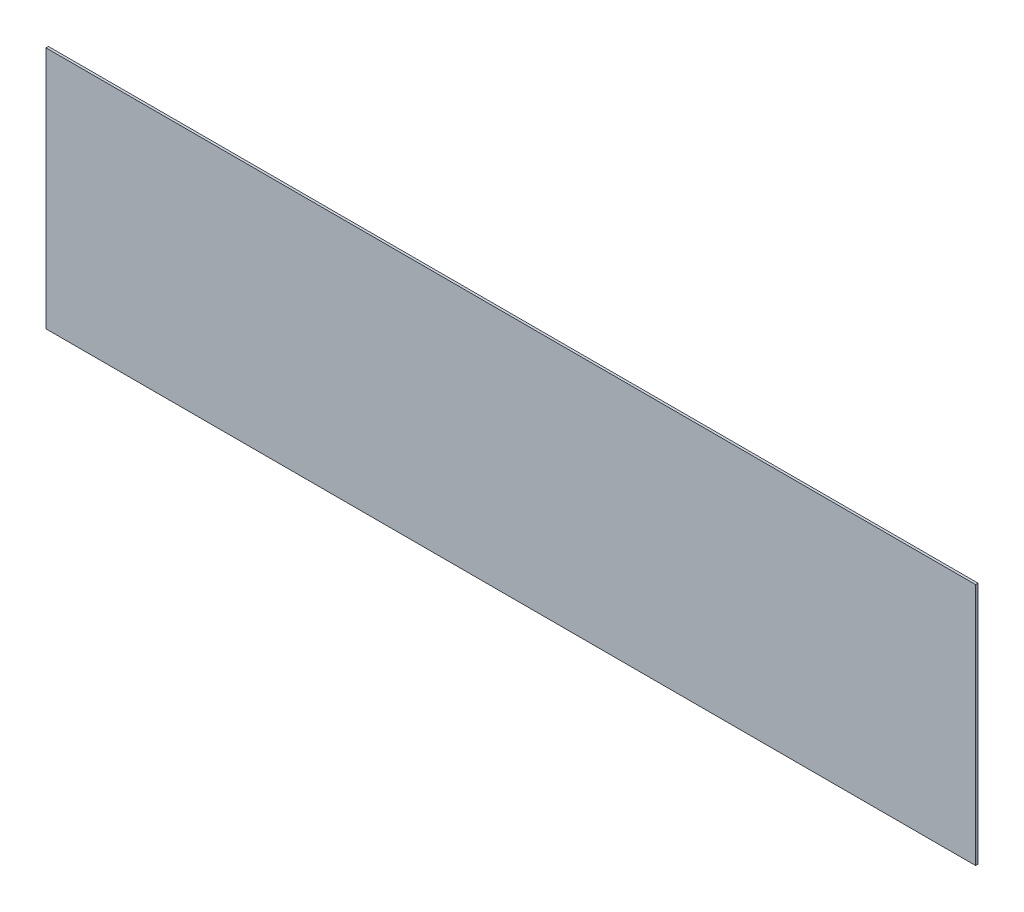
ISO-10303-21;
HEADER;
FILE_DESCRIPTION(('STEP AP214'),'2;1');
FILE_NAME('part.step','',(''),(''),'','','');
FILE_SCHEMA(('AUTOMOTIVE_DESIGN { 1 0 10303 214 1 1 1 1 }'));
ENDSEC;
DATA;
#1=APPLICATION_CONTEXT('core data for automotive mechanical design processes');
#2=APPLICATION_PROTOCOL_DEFINITION('international standard','automotive_design',2000,#1);
#3=PRODUCT_CONTEXT('',#1,'mechanical');
#4=PRODUCT('Part','Part','',(#3));
#5=PRODUCT_RELATED_PRODUCT_CATEGORY('part','',(#4));
#6=PRODUCT_DEFINITION_FORMATION('','',#4);
#7=PRODUCT_DEFINITION_CONTEXT('part definition',#1,'design');
#8=PRODUCT_DEFINITION('design','',#6,#7);
#9=PRODUCT_DEFINITION_SHAPE('','',#8);
#10=(LENGTH_UNIT() NAMED_UNIT(*) SI_UNIT(.MILLI.,.METRE.));
#11=(NAMED_UNIT(*) PLANE_ANGLE_UNIT() SI_UNIT($,.RADIAN.));
#12=(NAMED_UNIT(*) SI_UNIT($,.STERADIAN.) SOLID_ANGLE_UNIT());
#13=UNCERTAINTY_MEASURE_WITH_UNIT(LENGTH_MEASURE(1.E-05),#10,'distance_accuracy_value','');
#14=(GEOMETRIC_REPRESENTATION_CONTEXT(3) GLOBAL_UNCERTAINTY_ASSIGNED_CONTEXT((#13)) GLOBAL_UNIT_ASSIGNED_CONTEXT((#10,
#11,#12)) REPRESENTATION_CONTEXT('',''));
#15=CARTESIAN_POINT('',(0.,0.,0.));
#16=DIRECTION('',(0.,0.,1.));
#17=DIRECTION('',(1.,0.,0.));
#18=AXIS2_PLACEMENT_3D('',#15,#16,#17);
#19=CARTESIAN_POINT('',(189.06,49.5,1.));
#20=DIRECTION('',(-1.,0.,0.));
#21=DIRECTION('',(0.,0.,1.));
#22=AXIS2_PLACEMENT_3D('',#19,#20,#21);
#23=PLANE('',#22);
#24=DIRECTION('',(0.,1.,0.));
#25=VECTOR('',#24,1.);
#26=CARTESIAN_POINT('',(189.06,49.5,0.));
#27=LINE('',#26,#25);
#28=CARTESIAN_POINT('',(189.06,-49.5,0.));
#29=VERTEX_POINT('',#28);
#30=CARTESIAN_POINT('',(189.06,49.5,0.));
#31=VERTEX_POINT('',#30);
#32=EDGE_CURVE('E100',#29,#31,#27,.T.);
#33=ORIENTED_EDGE('',*,*,#32,.T.);
#34=DIRECTION('',(0.,0.,-1.));
#35=VECTOR('',#34,1.);
#36=CARTESIAN_POINT('',(189.06,49.5,1.));
#37=LINE('',#36,#35);
#38=CARTESIAN_POINT('',(189.06,49.5,1.));
#39=VERTEX_POINT('',#38);
#40=EDGE_CURVE('E11',#39,#31,#37,.T.);
#41=ORIENTED_EDGE('',*,*,#40,.F.);
#42=DIRECTION('',(0.,1.,0.));
#43=VECTOR('',#42,1.);
#44=CARTESIAN_POINT('',(189.06,49.5,1.));
#45=LINE('',#44,#43);
#46=CARTESIAN_POINT('',(189.06,-49.5,1.));
#47=VERTEX_POINT('',#46);
#48=EDGE_CURVE('E88',#47,#39,#45,.T.);
#49=ORIENTED_EDGE('',*,*,#48,.F.);
#50=DIRECTION('',(0.,0.,-1.));
#51=VECTOR('',#50,1.);
#52=CARTESIAN_POINT('',(189.06,-49.5,1.));
#53=LINE('',#52,#51);
#54=EDGE_CURVE('E96',#47,#29,#53,.T.);
#55=ORIENTED_EDGE('',*,*,#54,.T.);
#56=EDGE_LOOP('',(#33,#41,#49,#55));
#57=FACE_BOUND('',#56,.T.);
#58=ADVANCED_FACE('F37',(#57),#23,.F.);
#59=CARTESIAN_POINT('',(-189.06,49.5,1.));
#60=DIRECTION('',(0.,-1.,0.));
#61=DIRECTION('',(0.,0.,-1.));
#62=AXIS2_PLACEMENT_3D('',#59,#60,#61);
#63=PLANE('',#62);
#64=DIRECTION('',(-1.,0.,0.));
#65=VECTOR('',#64,1.);
#66=CARTESIAN_POINT('',(-189.06,49.5,0.));
#67=LINE('',#66,#65);
#68=CARTESIAN_POINT('',(-189.06,49.5,0.));
#69=VERTEX_POINT('',#68);
#70=EDGE_CURVE('E92',#31,#69,#67,.T.);
#71=ORIENTED_EDGE('',*,*,#70,.T.);
#72=DIRECTION('',(0.,0.,-1.));
#73=VECTOR('',#72,1.);
#74=CARTESIAN_POINT('',(-189.06,49.5,1.));
#75=LINE('',#74,#73);
#76=CARTESIAN_POINT('',(-189.06,49.5,1.));
#77=VERTEX_POINT('',#76);
#78=EDGE_CURVE('E45',#77,#69,#75,.T.);
#79=ORIENTED_EDGE('',*,*,#78,.F.);
#80=DIRECTION('',(-1.,0.,0.));
#81=VECTOR('',#80,1.);
#82=CARTESIAN_POINT('',(-189.06,49.5,1.));
#83=LINE('',#82,#81);
#84=EDGE_CURVE('E83',#39,#77,#83,.T.);
#85=ORIENTED_EDGE('',*,*,#84,.F.);
#86=ORIENTED_EDGE('',*,*,#40,.T.);
#87=EDGE_LOOP('',(#71,#79,#85,#86));
#88=FACE_BOUND('',#87,.T.);
#89=ADVANCED_FACE('F91',(#88),#63,.F.);
#90=CARTESIAN_POINT('',(-189.06,49.5,1.));
#91=DIRECTION('',(1.,0.,0.));
#92=DIRECTION('',(0.,0.,-1.));
#93=AXIS2_PLACEMENT_3D('',#90,#91,#92);
#94=PLANE('',#93);
#95=DIRECTION('',(0.,-1.,0.));
#96=VECTOR('',#95,1.);
#97=CARTESIAN_POINT('',(-189.06,49.5,0.));
#98=LINE('',#97,#96);
#99=CARTESIAN_POINT('',(-189.06,-49.5,0.));
#100=VERTEX_POINT('',#99);
#101=EDGE_CURVE('E70',#69,#100,#98,.T.);
#102=ORIENTED_EDGE('',*,*,#101,.T.);
#103=DIRECTION('',(0.,0.,-1.));
#104=VECTOR('',#103,1.);
#105=CARTESIAN_POINT('',(-189.06,-49.5,1.));
#106=LINE('',#105,#104);
#107=CARTESIAN_POINT('',(-189.06,-49.5,1.));
#108=VERTEX_POINT('',#107);
#109=EDGE_CURVE('E93',#108,#100,#106,.T.);
#110=ORIENTED_EDGE('',*,*,#109,.F.);
#111=DIRECTION('',(0.,-1.,0.));
#112=VECTOR('',#111,1.);
#113=CARTESIAN_POINT('',(-189.06,49.5,1.));
#114=LINE('',#113,#112);
#115=EDGE_CURVE('E86',#77,#108,#114,.T.);
#116=ORIENTED_EDGE('',*,*,#115,.F.);
#117=ORIENTED_EDGE('',*,*,#78,.T.);
#118=EDGE_LOOP('',(#102,#110,#116,#117));
#119=FACE_BOUND('',#118,.T.);
#120=ADVANCED_FACE('F94',(#119),#94,.F.);
#121=CARTESIAN_POINT('',(-189.06,-49.5,1.));
#122=DIRECTION('',(0.,1.,0.));
#123=DIRECTION('',(0.,0.,1.));
#124=AXIS2_PLACEMENT_3D('',#121,#122,#123);
#125=PLANE('',#124);
#126=DIRECTION('',(1.,0.,0.));
#127=VECTOR('',#126,1.);
#128=CARTESIAN_POINT('',(-189.06,-49.5,0.));
#129=LINE('',#128,#127);
#130=EDGE_CURVE('E76',#100,#29,#129,.T.);
#131=ORIENTED_EDGE('',*,*,#130,.T.);
#132=ORIENTED_EDGE('',*,*,#54,.F.);
#133=DIRECTION('',(1.,0.,0.));
#134=VECTOR('',#133,1.);
#135=CARTESIAN_POINT('',(-189.06,-49.5,1.));
#136=LINE('',#135,#134);
#137=EDGE_CURVE('E53',#108,#47,#136,.T.);
#138=ORIENTED_EDGE('',*,*,#137,.F.);
#139=ORIENTED_EDGE('',*,*,#109,.T.);
#140=EDGE_LOOP('',(#131,#132,#138,#139));
#141=FACE_BOUND('',#140,.T.);
#142=ADVANCED_FACE('F107',(#141),#125,.F.);
#143=CARTESIAN_POINT('',(0.,0.,1.));
#144=DIRECTION('',(0.,0.,1.));
#145=DIRECTION('',(1.,0.,0.));
#146=AXIS2_PLACEMENT_3D('',#143,#144,#145);
#147=PLANE('',#146);
#148=ORIENTED_EDGE('',*,*,#48,.T.);
#149=ORIENTED_EDGE('',*,*,#84,.T.);
#150=ORIENTED_EDGE('',*,*,#115,.T.);
#151=ORIENTED_EDGE('',*,*,#137,.T.);
#152=EDGE_LOOP('',(#148,#149,#150,#151));
#153=FACE_BOUND('',#152,.T.);
#154=ADVANCED_FACE('F84',(#153),#147,.T.);
#155=CARTESIAN_POINT('',(0.,0.,0.));
#156=DIRECTION('',(0.,0.,1.));
#157=DIRECTION('',(1.,0.,0.));
#158=AXIS2_PLACEMENT_3D('',#155,#156,#157);
#159=PLANE('',#158);
#160=ORIENTED_EDGE('',*,*,#32,.F.);
#161=ORIENTED_EDGE('',*,*,#130,.F.);
#162=ORIENTED_EDGE('',*,*,#101,.F.);
#163=ORIENTED_EDGE('',*,*,#70,.F.);
#164=EDGE_LOOP('',(#160,#161,#162,#163));
#165=FACE_BOUND('',#164,.T.);
#166=ADVANCED_FACE('F110',(#165),#159,.F.);
#167=CLOSED_SHELL('',(#58,#89,#120,#142,#154,#166));
#168=MANIFOLD_SOLID_BREP('B2',#167);
#169=ADVANCED_BREP_SHAPE_REPRESENTATION('',(#18,#168),#14);
#170=SHAPE_DEFINITION_REPRESENTATION(#9,#169);
ENDSEC;
END-ISO-10303-21;
